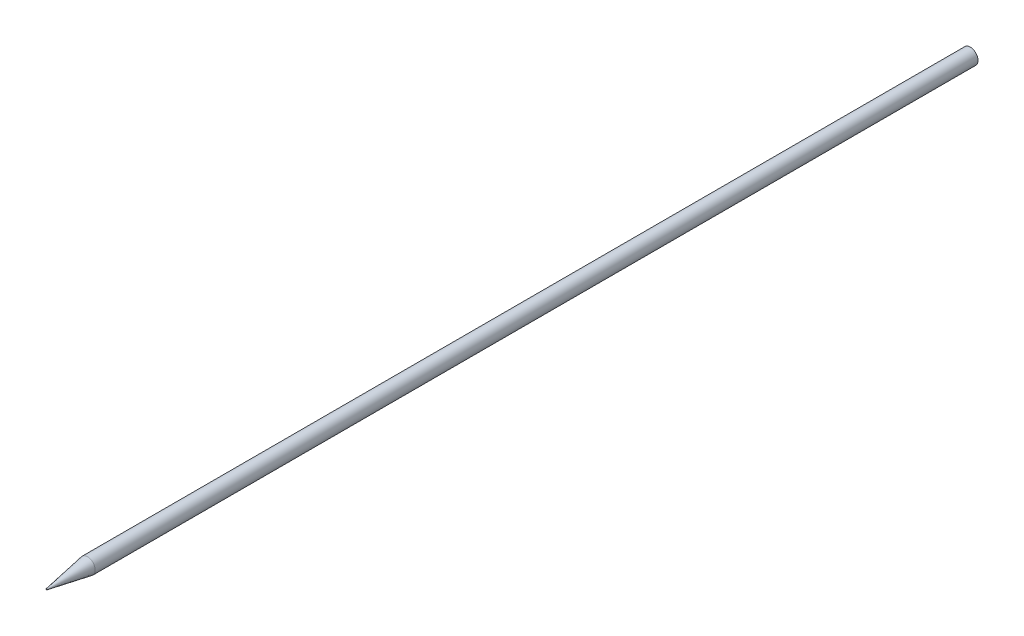
ISO-10303-21;
HEADER;
FILE_DESCRIPTION(('STEP AP214'),'2;1');
FILE_NAME('part.step','',(''),(''),'','','');
FILE_SCHEMA(('AUTOMOTIVE_DESIGN { 1 0 10303 214 1 1 1 1 }'));
ENDSEC;
DATA;
#1=APPLICATION_CONTEXT('core data for automotive mechanical design processes');
#2=APPLICATION_PROTOCOL_DEFINITION('international standard','automotive_design',2000,#1);
#3=PRODUCT_CONTEXT('',#1,'mechanical');
#4=PRODUCT('Part','Part','',(#3));
#5=PRODUCT_RELATED_PRODUCT_CATEGORY('part','',(#4));
#6=PRODUCT_DEFINITION_FORMATION('','',#4);
#7=PRODUCT_DEFINITION_CONTEXT('part definition',#1,'design');
#8=PRODUCT_DEFINITION('design','',#6,#7);
#9=PRODUCT_DEFINITION_SHAPE('','',#8);
#10=(LENGTH_UNIT() NAMED_UNIT(*) SI_UNIT(.MILLI.,.METRE.));
#11=(NAMED_UNIT(*) PLANE_ANGLE_UNIT() SI_UNIT($,.RADIAN.));
#12=(NAMED_UNIT(*) SI_UNIT($,.STERADIAN.) SOLID_ANGLE_UNIT());
#13=UNCERTAINTY_MEASURE_WITH_UNIT(LENGTH_MEASURE(1.E-05),#10,'distance_accuracy_value','');
#14=(GEOMETRIC_REPRESENTATION_CONTEXT(3) GLOBAL_UNCERTAINTY_ASSIGNED_CONTEXT((#13)) GLOBAL_UNIT_ASSIGNED_CONTEXT((#10,
#11,#12)) REPRESENTATION_CONTEXT('',''));
#15=CARTESIAN_POINT('',(0.,0.,0.));
#16=DIRECTION('',(0.,0.,1.));
#17=DIRECTION('',(1.,0.,0.));
#18=AXIS2_PLACEMENT_3D('',#15,#16,#17);
#19=CARTESIAN_POINT('',(0.,0.,22.86));
#20=DIRECTION('',(0.,0.,-1.));
#21=DIRECTION('',(-1.,0.,0.));
#22=AXIS2_PLACEMENT_3D('',#19,#20,#21);
#23=CYLINDRICAL_SURFACE('',#22,0.1905);
#24=CARTESIAN_POINT('',(0.,0.,21.844));
#25=DIRECTION('',(0.,0.,1.));
#26=DIRECTION('',(1.,0.,0.));
#27=AXIS2_PLACEMENT_3D('',#24,#25,#26);
#28=CIRCLE('',#27,0.1905);
#29=CARTESIAN_POINT('',(-0.1905,0.,21.8439999999999));
#30=VERTEX_POINT('',#29);
#31=EDGE_CURVE('E10',#30,#30,#28,.F.);
#32=ORIENTED_EDGE('',*,*,#31,.T.);
#33=EDGE_LOOP('',(#32));
#34=FACE_BOUND('',#33,.T.);
#35=CARTESIAN_POINT('',(0.,0.,0.));
#36=DIRECTION('',(0.,0.,1.));
#37=DIRECTION('',(1.,0.,0.));
#38=AXIS2_PLACEMENT_3D('',#35,#36,#37);
#39=CIRCLE('',#38,0.1905);
#40=CARTESIAN_POINT('',(0.1905,0.,0.));
#41=VERTEX_POINT('',#40);
#42=EDGE_CURVE('E41',#41,#41,#39,.T.);
#43=ORIENTED_EDGE('',*,*,#42,.T.);
#44=EDGE_LOOP('',(#43));
#45=FACE_BOUND('',#44,.T.);
#46=ADVANCED_FACE('F30',(#34,#45),#23,.T.);
#47=CARTESIAN_POINT('',(0.,0.,22.86));
#48=DIRECTION('',(0.,0.,1.));
#49=DIRECTION('',(1.,0.,0.));
#50=AXIS2_PLACEMENT_3D('',#47,#48,#49);
#51=PLANE('',#50);
#52=CARTESIAN_POINT('',(0.,0.,22.86));
#53=DIRECTION('',(0.,0.,1.));
#54=DIRECTION('',(1.,0.,0.));
#55=AXIS2_PLACEMENT_3D('',#52,#53,#54);
#56=CIRCLE('',#55,0.011351787600194);
#57=CARTESIAN_POINT('',(-0.0113517876001943,0.,22.86));
#58=VERTEX_POINT('',#57);
#59=EDGE_CURVE('E37',#58,#58,#56,.T.);
#60=ORIENTED_EDGE('',*,*,#59,.T.);
#61=EDGE_LOOP('',(#60));
#62=FACE_BOUND('',#61,.T.);
#63=ADVANCED_FACE('F51',(#62),#51,.T.);
#64=CARTESIAN_POINT('',(0.,0.,0.));
#65=DIRECTION('',(0.,0.,1.));
#66=DIRECTION('',(1.,0.,0.));
#67=AXIS2_PLACEMENT_3D('',#64,#65,#66);
#68=PLANE('',#67);
#69=ORIENTED_EDGE('',*,*,#42,.F.);
#70=EDGE_LOOP('',(#69));
#71=FACE_BOUND('',#70,.T.);
#72=ADVANCED_FACE('F49',(#71),#68,.F.);
#73=CARTESIAN_POINT('',(0.,0.,22.86));
#74=DIRECTION('',(0.,0.,-1.));
#75=DIRECTION('',(-1.,0.,0.));
#76=AXIS2_PLACEMENT_3D('',#73,#74,#75);
#77=CONICAL_SURFACE('',#76,0.011351787600194,0.17453292519943);
#78=CARTESIAN_POINT('',(-0.1905,0.,21.8439999999999));
#79=CARTESIAN_POINT('',(-0.188633872787502,0.,21.8545833333333));
#80=CARTESIAN_POINT('',(-0.186767745575004,0.,21.8651666666666));
#81=CARTESIAN_POINT('',(-0.183035491150008,0.,21.8863333333333));
#82=CARTESIAN_POINT('',(-0.18116936393751,0.,21.8969166666666));
#83=CARTESIAN_POINT('',(-0.177437109512514,0.,21.9180833333333));
#84=CARTESIAN_POINT('',(-0.175570982300016,0.,21.9286666666666));
#85=CARTESIAN_POINT('',(-0.17183872787502,0.,21.9498333333333));
#86=CARTESIAN_POINT('',(-0.169972600662523,0.,21.9604166666666));
#87=CARTESIAN_POINT('',(-0.166240346237527,0.,21.9815833333333));
#88=CARTESIAN_POINT('',(-0.164374219025029,0.,21.9921666666666));
#89=CARTESIAN_POINT('',(-0.160641964600033,0.,22.0133333333333));
#90=CARTESIAN_POINT('',(-0.158775837387535,0.,22.0239166666666));
#91=CARTESIAN_POINT('',(-0.155043582962539,0.,22.0450833333333));
#92=CARTESIAN_POINT('',(-0.153177455750041,0.,22.0556666666666));
#93=CARTESIAN_POINT('',(-0.149445201325045,0.,22.0768333333333));
#94=CARTESIAN_POINT('',(-0.147579074112547,0.,22.0874166666666));
#95=CARTESIAN_POINT('',(-0.143846819687551,0.,22.1085833333333));
#96=CARTESIAN_POINT('',(-0.141980692475053,0.,22.1191666666666));
#97=CARTESIAN_POINT('',(-0.138248438050057,0.,22.1403333333333));
#98=CARTESIAN_POINT('',(-0.136382310837559,0.,22.1509166666666));
#99=CARTESIAN_POINT('',(-0.132650056412563,0.,22.1720833333333));
#100=CARTESIAN_POINT('',(-0.130783929200065,0.,22.1826666666666));
#101=CARTESIAN_POINT('',(-0.127051674775069,0.,22.2038333333333));
#102=CARTESIAN_POINT('',(-0.125185547562571,0.,22.2144166666666));
#103=CARTESIAN_POINT('',(-0.121453293137575,0.,22.2355833333333));
#104=CARTESIAN_POINT('',(-0.119587165925077,0.,22.2461666666666));
#105=CARTESIAN_POINT('',(-0.115854911500081,0.,22.2673333333333));
#106=CARTESIAN_POINT('',(-0.113988784287583,0.,22.2779166666666));
#107=CARTESIAN_POINT('',(-0.110256529862587,0.,22.2990833333333));
#108=CARTESIAN_POINT('',(-0.108390402650089,0.,22.3096666666666));
#109=CARTESIAN_POINT('',(-0.104658148225093,0.,22.3308333333333));
#110=CARTESIAN_POINT('',(-0.102792021012595,0.,22.3414166666666));
#111=CARTESIAN_POINT('',(-0.0990597665875993,0.,22.3625833333333));
#112=CARTESIAN_POINT('',(-0.0971936393751012,0.,22.3731666666666));
#113=CARTESIAN_POINT('',(-0.0934613849501053,0.,22.3943333333333));
#114=CARTESIAN_POINT('',(-0.0915952577376075,0.,22.4049166666666));
#115=CARTESIAN_POINT('',(-0.0878630033126116,0.,22.4260833333333));
#116=CARTESIAN_POINT('',(-0.0859968761001135,0.,22.4366666666666));
#117=CARTESIAN_POINT('',(-0.0822646216751175,0.,22.4578333333333));
#118=CARTESIAN_POINT('',(-0.0803984944626196,0.,22.4684166666666));
#119=CARTESIAN_POINT('',(-0.0766662400376236,0.,22.4895833333333));
#120=CARTESIAN_POINT('',(-0.0748001128251255,0.,22.5001666666666));
#121=CARTESIAN_POINT('',(-0.0710678584001296,0.,22.5213333333333));
#122=CARTESIAN_POINT('',(-0.0692017311876317,0.,22.5319166666666));
#123=CARTESIAN_POINT('',(-0.0654694767626358,0.,22.5530833333333));
#124=CARTESIAN_POINT('',(-0.0636033495501378,0.,22.5636666666666));
#125=CARTESIAN_POINT('',(-0.0598710951251417,0.,22.5848333333333));
#126=CARTESIAN_POINT('',(-0.0580049679126437,0.,22.5954166666666));
#127=CARTESIAN_POINT('',(-0.0542727134876478,0.,22.6165833333333));
#128=CARTESIAN_POINT('',(-0.0524065862751499,0.,22.6271666666667));
#129=CARTESIAN_POINT('',(-0.048674331850154,0.,22.6483333333333));
#130=CARTESIAN_POINT('',(-0.0468082046376559,0.,22.6589166666667));
#131=CARTESIAN_POINT('',(-0.0430759502126599,0.,22.6800833333333));
#132=CARTESIAN_POINT('',(-0.041209823000162,0.,22.6906666666667));
#133=CARTESIAN_POINT('',(-0.037477568575166,0.,22.7118333333333));
#134=CARTESIAN_POINT('',(-0.0356114413626679,0.,22.7224166666667));
#135=CARTESIAN_POINT('',(-0.031879186937672,0.,22.7435833333333));
#136=CARTESIAN_POINT('',(-0.0300130597251742,0.,22.7541666666667));
#137=CARTESIAN_POINT('',(-0.0262808053001783,0.,22.7753333333333));
#138=CARTESIAN_POINT('',(-0.0244146780876802,0.,22.7859166666667));
#139=CARTESIAN_POINT('',(-0.0206824236626842,0.,22.8070833333333));
#140=CARTESIAN_POINT('',(-0.0188162964501861,0.,22.8176666666667));
#141=CARTESIAN_POINT('',(-0.0150840420251901,0.,22.8388333333333));
#142=CARTESIAN_POINT('',(-0.0132179148126921,0.,22.8494166666667));
#143=CARTESIAN_POINT('',(-0.0113517876001943,0.,22.86));
#144=B_SPLINE_CURVE_WITH_KNOTS('',3,(#78,#79,#80,#81,#82,#83,#84,#85,#86,#87,#88,#89,#90,#91,
#92,#93,#94,#95,#96,#97,#98,#99,#100,#101,#102,#103,#104,#105,#106,#107,#108,#109,#110,#111,
#112,#113,#114,#115,#116,#117,#118,#119,#120,#121,#122,#123,#124,#125,#126,#127,#128,#129,#130,
#131,#132,#133,#134,#135,#136,#137,#138,#139,#140,#141,#142,#143),.UNSPECIFIED.,.F.,.F.,(4,2,2,
2,2,2,2,2,2,2,2,2,2,2,2,2,2,2,2,2,2,2,2,2,2,2,2,2,2,2,2,2,4),(0.,0.0322397949273764,
0.0644795898547493,0.0967193847821223,0.128959179709499,0.161198974636872,0.193438769564245,
0.225678564491617,0.257918359418994,0.290158154346367,0.32239794927374,0.354637744201116,
0.386877539128489,0.419117334055862,0.451357128983235,0.483596923910611,0.515836718837984,
0.548076513765357,0.580316308692734,0.612556103620106,0.644795898547479,0.677035693474852,
0.709275488402229,0.741515283329602,0.773755078256975,0.805994873184351,0.838234668111724,
0.870474463039097,0.90271425796647,0.934954052893846,0.967193847821219,0.999433642748592,
1.03167343767597),.UNSPECIFIED.);
#145=EDGE_CURVE('BSEAM32',#30,#58,#144,.T.);
#146=ORIENTED_EDGE('',*,*,#31,.F.);
#147=ORIENTED_EDGE('',*,*,#59,.F.);
#148=ORIENTED_EDGE('',*,*,#145,.T.);
#149=ORIENTED_EDGE('',*,*,#145,.F.);
#150=EDGE_LOOP('',(#146,#148,#147,#149));
#151=FACE_BOUND('',#150,.T.);
#152=ADVANCED_FACE('F32',(#151),#77,.T.);
#153=CLOSED_SHELL('',(#46,#63,#72,#152));
#154=MANIFOLD_SOLID_BREP('B2',#153);
#155=ADVANCED_BREP_SHAPE_REPRESENTATION('',(#18,#154),#14);
#156=SHAPE_DEFINITION_REPRESENTATION(#9,#155);
ENDSEC;
END-ISO-10303-21;
